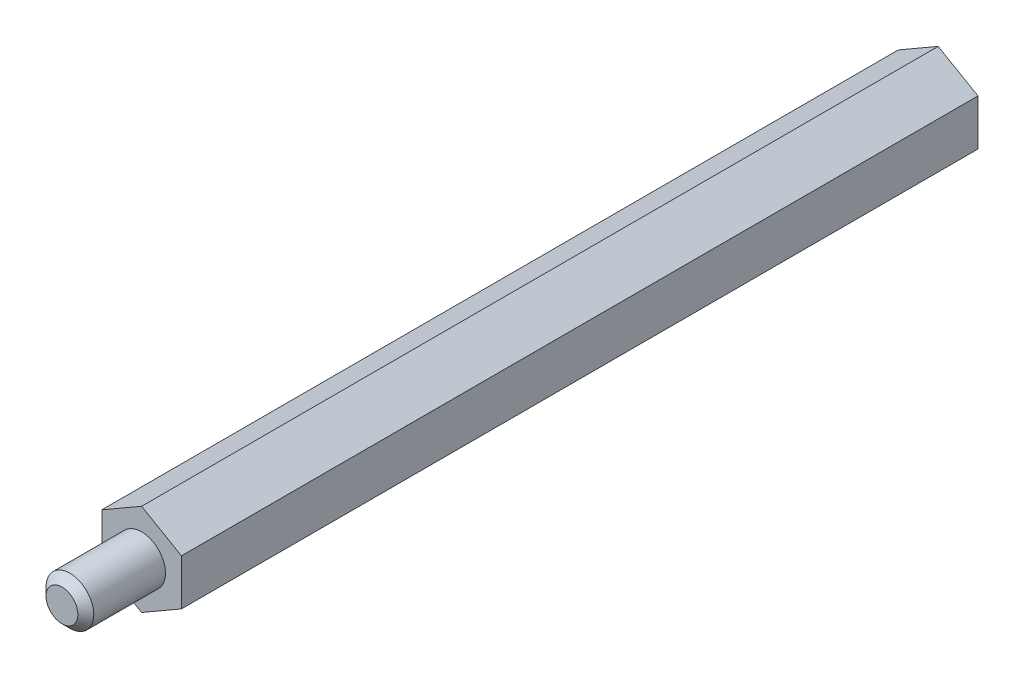
ISO-10303-21;
HEADER;
FILE_DESCRIPTION(('STEP AP214'),'2;1');
FILE_NAME('part.step','',(''),(''),'','','');
FILE_SCHEMA(('AUTOMOTIVE_DESIGN { 1 0 10303 214 1 1 1 1 }'));
ENDSEC;
DATA;
#1=APPLICATION_CONTEXT('core data for automotive mechanical design processes');
#2=APPLICATION_PROTOCOL_DEFINITION('international standard','automotive_design',2000,#1);
#3=PRODUCT_CONTEXT('',#1,'mechanical');
#4=PRODUCT('Part','Part','',(#3));
#5=PRODUCT_RELATED_PRODUCT_CATEGORY('part','',(#4));
#6=PRODUCT_DEFINITION_FORMATION('','',#4);
#7=PRODUCT_DEFINITION_CONTEXT('part definition',#1,'design');
#8=PRODUCT_DEFINITION('design','',#6,#7);
#9=PRODUCT_DEFINITION_SHAPE('','',#8);
#10=(LENGTH_UNIT() NAMED_UNIT(*) SI_UNIT(.MILLI.,.METRE.));
#11=(NAMED_UNIT(*) PLANE_ANGLE_UNIT() SI_UNIT($,.RADIAN.));
#12=(NAMED_UNIT(*) SI_UNIT($,.STERADIAN.) SOLID_ANGLE_UNIT());
#13=UNCERTAINTY_MEASURE_WITH_UNIT(LENGTH_MEASURE(1.E-05),#10,'distance_accuracy_value','');
#14=(GEOMETRIC_REPRESENTATION_CONTEXT(3) GLOBAL_UNCERTAINTY_ASSIGNED_CONTEXT((#13)) GLOBAL_UNIT_ASSIGNED_CONTEXT((#10,
#11,#12)) REPRESENTATION_CONTEXT('',''));
#15=CARTESIAN_POINT('',(0.,0.,0.));
#16=DIRECTION('',(0.,0.,1.));
#17=DIRECTION('',(1.,0.,0.));
#18=AXIS2_PLACEMENT_3D('',#15,#16,#17);
#19=CARTESIAN_POINT('',(0.,-2.88675134594813,50.));
#20=DIRECTION('',(-0.5,0.866025403784439,0.));
#21=DIRECTION('',(-0.866025403784439,-0.5,0.));
#22=AXIS2_PLACEMENT_3D('',#19,#20,#21);
#23=PLANE('',#22);
#24=DIRECTION('',(0.866025403784439,0.5,0.));
#25=VECTOR('',#24,1.);
#26=CARTESIAN_POINT('',(0.,-2.88675134594813,0.));
#27=LINE('',#26,#25);
#28=CARTESIAN_POINT('',(0.,-2.88675134594813,0.));
#29=VERTEX_POINT('',#28);
#30=CARTESIAN_POINT('',(2.5,-1.44337567297407,0.));
#31=VERTEX_POINT('',#30);
#32=EDGE_CURVE('E118',#29,#31,#27,.T.);
#33=ORIENTED_EDGE('',*,*,#32,.T.);
#34=DIRECTION('',(0.,0.,-1.));
#35=VECTOR('',#34,1.);
#36=CARTESIAN_POINT('',(2.5,-1.44337567297407,50.));
#37=LINE('',#36,#35);
#38=CARTESIAN_POINT('',(2.5,-1.44337567297407,50.));
#39=VERTEX_POINT('',#38);
#40=EDGE_CURVE('E136',#39,#31,#37,.T.);
#41=ORIENTED_EDGE('',*,*,#40,.F.);
#42=DIRECTION('',(0.866025403784439,0.5,0.));
#43=VECTOR('',#42,1.);
#44=CARTESIAN_POINT('',(0.,-2.88675134594813,50.));
#45=LINE('',#44,#43);
#46=CARTESIAN_POINT('',(0.,-2.88675134594813,50.));
#47=VERTEX_POINT('',#46);
#48=EDGE_CURVE('E129',#47,#39,#45,.T.);
#49=ORIENTED_EDGE('',*,*,#48,.F.);
#50=DIRECTION('',(0.,0.,-1.));
#51=VECTOR('',#50,1.);
#52=CARTESIAN_POINT('',(0.,-2.88675134594813,50.));
#53=LINE('',#52,#51);
#54=EDGE_CURVE('E114',#47,#29,#53,.T.);
#55=ORIENTED_EDGE('',*,*,#54,.T.);
#56=EDGE_LOOP('',(#33,#41,#49,#55));
#57=FACE_BOUND('',#56,.T.);
#58=ADVANCED_FACE('F32',(#57),#23,.F.);
#59=CARTESIAN_POINT('',(2.5,-1.44337567297407,50.));
#60=DIRECTION('',(-1.,0.,0.));
#61=DIRECTION('',(0.,0.,1.));
#62=AXIS2_PLACEMENT_3D('',#59,#60,#61);
#63=PLANE('',#62);
#64=DIRECTION('',(0.,1.,0.));
#65=VECTOR('',#64,1.);
#66=CARTESIAN_POINT('',(2.5,-1.44337567297407,0.));
#67=LINE('',#66,#65);
#68=CARTESIAN_POINT('',(2.5,1.44337567297407,0.));
#69=VERTEX_POINT('',#68);
#70=EDGE_CURVE('E121',#31,#69,#67,.T.);
#71=ORIENTED_EDGE('',*,*,#70,.T.);
#72=DIRECTION('',(0.,0.,-1.));
#73=VECTOR('',#72,1.);
#74=CARTESIAN_POINT('',(2.5,1.44337567297407,50.));
#75=LINE('',#74,#73);
#76=CARTESIAN_POINT('',(2.5,1.44337567297407,50.));
#77=VERTEX_POINT('',#76);
#78=EDGE_CURVE('E133',#77,#69,#75,.T.);
#79=ORIENTED_EDGE('',*,*,#78,.F.);
#80=DIRECTION('',(0.,1.,0.));
#81=VECTOR('',#80,1.);
#82=CARTESIAN_POINT('',(2.5,-1.44337567297407,50.));
#83=LINE('',#82,#81);
#84=EDGE_CURVE('E87',#39,#77,#83,.T.);
#85=ORIENTED_EDGE('',*,*,#84,.F.);
#86=ORIENTED_EDGE('',*,*,#40,.T.);
#87=EDGE_LOOP('',(#71,#79,#85,#86));
#88=FACE_BOUND('',#87,.T.);
#89=ADVANCED_FACE('F153',(#88),#63,.F.);
#90=CARTESIAN_POINT('',(2.5,1.44337567297407,50.));
#91=DIRECTION('',(-0.5,-0.866025403784439,0.));
#92=DIRECTION('',(0.866025403784439,-0.5,0.));
#93=AXIS2_PLACEMENT_3D('',#90,#91,#92);
#94=PLANE('',#93);
#95=DIRECTION('',(-0.866025403784439,0.5,0.));
#96=VECTOR('',#95,1.);
#97=CARTESIAN_POINT('',(2.5,1.44337567297407,0.));
#98=LINE('',#97,#96);
#99=CARTESIAN_POINT('',(0.,2.88675134594813,0.));
#100=VERTEX_POINT('',#99);
#101=EDGE_CURVE('E124',#69,#100,#98,.T.);
#102=ORIENTED_EDGE('',*,*,#101,.T.);
#103=DIRECTION('',(0.,0.,-1.));
#104=VECTOR('',#103,1.);
#105=CARTESIAN_POINT('',(0.,2.88675134594813,50.));
#106=LINE('',#105,#104);
#107=CARTESIAN_POINT('',(0.,2.88675134594813,50.));
#108=VERTEX_POINT('',#107);
#109=EDGE_CURVE('E109',#108,#100,#106,.T.);
#110=ORIENTED_EDGE('',*,*,#109,.F.);
#111=DIRECTION('',(-0.866025403784439,0.5,0.));
#112=VECTOR('',#111,1.);
#113=CARTESIAN_POINT('',(2.5,1.44337567297407,50.));
#114=LINE('',#113,#112);
#115=EDGE_CURVE('E100',#77,#108,#114,.T.);
#116=ORIENTED_EDGE('',*,*,#115,.F.);
#117=ORIENTED_EDGE('',*,*,#78,.T.);
#118=EDGE_LOOP('',(#102,#110,#116,#117));
#119=FACE_BOUND('',#118,.T.);
#120=ADVANCED_FACE('F158',(#119),#94,.F.);
#121=CARTESIAN_POINT('',(0.,2.88675134594813,50.));
#122=DIRECTION('',(0.5,-0.866025403784439,0.));
#123=DIRECTION('',(0.866025403784439,0.5,0.));
#124=AXIS2_PLACEMENT_3D('',#121,#122,#123);
#125=PLANE('',#124);
#126=DIRECTION('',(-0.866025403784439,-0.5,0.));
#127=VECTOR('',#126,1.);
#128=CARTESIAN_POINT('',(0.,2.88675134594813,0.));
#129=LINE('',#128,#127);
#130=CARTESIAN_POINT('',(-2.5,1.44337567297407,0.));
#131=VERTEX_POINT('',#130);
#132=EDGE_CURVE('E108',#100,#131,#129,.T.);
#133=ORIENTED_EDGE('',*,*,#132,.T.);
#134=DIRECTION('',(0.,0.,-1.));
#135=VECTOR('',#134,1.);
#136=CARTESIAN_POINT('',(-2.5,1.44337567297407,50.));
#137=LINE('',#136,#135);
#138=CARTESIAN_POINT('',(-2.5,1.44337567297407,50.));
#139=VERTEX_POINT('',#138);
#140=EDGE_CURVE('E105',#139,#131,#137,.T.);
#141=ORIENTED_EDGE('',*,*,#140,.F.);
#142=DIRECTION('',(-0.866025403784439,-0.5,0.));
#143=VECTOR('',#142,1.);
#144=CARTESIAN_POINT('',(0.,2.88675134594813,50.));
#145=LINE('',#144,#143);
#146=EDGE_CURVE('E94',#108,#139,#145,.T.);
#147=ORIENTED_EDGE('',*,*,#146,.F.);
#148=ORIENTED_EDGE('',*,*,#109,.T.);
#149=EDGE_LOOP('',(#133,#141,#147,#148));
#150=FACE_BOUND('',#149,.T.);
#151=ADVANCED_FACE('F106',(#150),#125,.F.);
#152=CARTESIAN_POINT('',(-2.5,1.44337567297407,50.));
#153=DIRECTION('',(1.,0.,0.));
#154=DIRECTION('',(0.,1.,0.));
#155=AXIS2_PLACEMENT_3D('',#152,#153,#154);
#156=PLANE('',#155);
#157=DIRECTION('',(0.,-1.,0.));
#158=VECTOR('',#157,1.);
#159=CARTESIAN_POINT('',(-2.5,1.44337567297407,0.));
#160=LINE('',#159,#158);
#161=CARTESIAN_POINT('',(-2.5,-1.44337567297406,0.));
#162=VERTEX_POINT('',#161);
#163=EDGE_CURVE('E72',#131,#162,#160,.T.);
#164=ORIENTED_EDGE('',*,*,#163,.T.);
#165=DIRECTION('',(0.,0.,-1.));
#166=VECTOR('',#165,1.);
#167=CARTESIAN_POINT('',(-2.5,-1.44337567297406,50.));
#168=LINE('',#167,#166);
#169=CARTESIAN_POINT('',(-2.5,-1.44337567297406,50.));
#170=VERTEX_POINT('',#169);
#171=EDGE_CURVE('E110',#170,#162,#168,.T.);
#172=ORIENTED_EDGE('',*,*,#171,.F.);
#173=DIRECTION('',(0.,-1.,0.));
#174=VECTOR('',#173,1.);
#175=CARTESIAN_POINT('',(-2.5,1.44337567297407,50.));
#176=LINE('',#175,#174);
#177=EDGE_CURVE('E98',#139,#170,#176,.T.);
#178=ORIENTED_EDGE('',*,*,#177,.F.);
#179=ORIENTED_EDGE('',*,*,#140,.T.);
#180=EDGE_LOOP('',(#164,#172,#178,#179));
#181=FACE_BOUND('',#180,.T.);
#182=ADVANCED_FACE('F112',(#181),#156,.F.);
#183=CARTESIAN_POINT('',(-2.5,-1.44337567297406,50.));
#184=DIRECTION('',(0.5,0.866025403784439,0.));
#185=DIRECTION('',(-0.866025403784439,0.5,0.));
#186=AXIS2_PLACEMENT_3D('',#183,#184,#185);
#187=PLANE('',#186);
#188=DIRECTION('',(0.866025403784439,-0.5,0.));
#189=VECTOR('',#188,1.);
#190=CARTESIAN_POINT('',(-2.5,-1.44337567297406,0.));
#191=LINE('',#190,#189);
#192=EDGE_CURVE('E78',#162,#29,#191,.T.);
#193=ORIENTED_EDGE('',*,*,#192,.T.);
#194=ORIENTED_EDGE('',*,*,#54,.F.);
#195=DIRECTION('',(0.866025403784439,-0.5,0.));
#196=VECTOR('',#195,1.);
#197=CARTESIAN_POINT('',(-2.5,-1.44337567297406,50.));
#198=LINE('',#197,#196);
#199=EDGE_CURVE('E49',#170,#47,#198,.T.);
#200=ORIENTED_EDGE('',*,*,#199,.F.);
#201=ORIENTED_EDGE('',*,*,#171,.T.);
#202=EDGE_LOOP('',(#193,#194,#200,#201));
#203=FACE_BOUND('',#202,.T.);
#204=ADVANCED_FACE('F168',(#203),#187,.F.);
#205=CARTESIAN_POINT('',(0.,0.,50.));
#206=DIRECTION('',(0.,0.,1.));
#207=DIRECTION('',(1.,0.,0.));
#208=AXIS2_PLACEMENT_3D('',#205,#206,#207);
#209=PLANE('',#208);
#210=CARTESIAN_POINT('',(0.,0.,50.));
#211=DIRECTION('',(0.,0.,1.));
#212=DIRECTION('',(1.,0.,0.));
#213=AXIS2_PLACEMENT_3D('',#210,#211,#212);
#214=CIRCLE('',#213,1.5);
#215=CARTESIAN_POINT('',(1.5,0.,50.));
#216=VERTEX_POINT('',#215);
#217=EDGE_CURVE('E122',#216,#216,#214,.T.);
#218=ORIENTED_EDGE('',*,*,#217,.F.);
#219=EDGE_LOOP('',(#218));
#220=FACE_BOUND('',#219,.T.);
#221=ORIENTED_EDGE('',*,*,#48,.T.);
#222=ORIENTED_EDGE('',*,*,#84,.T.);
#223=ORIENTED_EDGE('',*,*,#115,.T.);
#224=ORIENTED_EDGE('',*,*,#146,.T.);
#225=ORIENTED_EDGE('',*,*,#177,.T.);
#226=ORIENTED_EDGE('',*,*,#199,.T.);
#227=EDGE_LOOP('',(#221,#222,#223,#224,#225,#226));
#228=FACE_BOUND('',#227,.T.);
#229=ADVANCED_FACE('F96',(#220,#228),#209,.T.);
#230=CARTESIAN_POINT('',(0.,0.,0.));
#231=DIRECTION('',(0.,0.,1.));
#232=DIRECTION('',(1.,0.,0.));
#233=AXIS2_PLACEMENT_3D('',#230,#231,#232);
#234=PLANE('',#233);
#235=CARTESIAN_POINT('',(0.,0.,0.));
#236=DIRECTION('',(0.,0.,-1.));
#237=DIRECTION('',(-1.,0.,0.));
#238=AXIS2_PLACEMENT_3D('',#235,#236,#237);
#239=CIRCLE('',#238,1.25);
#240=CARTESIAN_POINT('',(-1.25,0.,0.));
#241=VERTEX_POINT('',#240);
#242=EDGE_CURVE('E194',#241,#241,#239,.T.);
#243=ORIENTED_EDGE('',*,*,#242,.F.);
#244=EDGE_LOOP('',(#243));
#245=FACE_BOUND('',#244,.T.);
#246=ORIENTED_EDGE('',*,*,#32,.F.);
#247=ORIENTED_EDGE('',*,*,#192,.F.);
#248=ORIENTED_EDGE('',*,*,#163,.F.);
#249=ORIENTED_EDGE('',*,*,#132,.F.);
#250=ORIENTED_EDGE('',*,*,#101,.F.);
#251=ORIENTED_EDGE('',*,*,#70,.F.);
#252=EDGE_LOOP('',(#246,#247,#248,#249,#250,#251));
#253=FACE_BOUND('',#252,.T.);
#254=ADVANCED_FACE('F171',(#245,#253),#234,.F.);
#255=CARTESIAN_POINT('',(0.,0.,55.));
#256=DIRECTION('',(0.,0.,-1.));
#257=DIRECTION('',(-1.,0.,0.));
#258=AXIS2_PLACEMENT_3D('',#255,#256,#257);
#259=CYLINDRICAL_SURFACE('',#258,1.5);
#260=CARTESIAN_POINT('',(0.,0.,54.5));
#261=DIRECTION('',(0.,0.,1.));
#262=DIRECTION('',(1.,0.,0.));
#263=AXIS2_PLACEMENT_3D('',#260,#261,#262);
#264=CIRCLE('',#263,1.5);
#265=CARTESIAN_POINT('',(1.5,0.,54.5));
#266=VERTEX_POINT('',#265);
#267=EDGE_CURVE('E11',#266,#266,#264,.F.);
#268=ORIENTED_EDGE('',*,*,#267,.T.);
#269=EDGE_LOOP('',(#268));
#270=FACE_BOUND('',#269,.T.);
#271=ORIENTED_EDGE('',*,*,#217,.T.);
#272=EDGE_LOOP('',(#271));
#273=FACE_BOUND('',#272,.T.);
#274=ADVANCED_FACE('F174',(#270,#273),#259,.T.);
#275=CARTESIAN_POINT('',(0.,0.,55.));
#276=DIRECTION('',(0.,0.,1.));
#277=DIRECTION('',(1.,0.,0.));
#278=AXIS2_PLACEMENT_3D('',#275,#276,#277);
#279=PLANE('',#278);
#280=CARTESIAN_POINT('',(0.,0.,55.));
#281=DIRECTION('',(0.,0.,1.));
#282=DIRECTION('',(1.,0.,0.));
#283=AXIS2_PLACEMENT_3D('',#280,#281,#282);
#284=CIRCLE('',#283,1.);
#285=CARTESIAN_POINT('',(1.,0.,55.));
#286=VERTEX_POINT('',#285);
#287=EDGE_CURVE('E41',#286,#286,#284,.T.);
#288=ORIENTED_EDGE('',*,*,#287,.T.);
#289=EDGE_LOOP('',(#288));
#290=FACE_BOUND('',#289,.T.);
#291=ADVANCED_FACE('F140',(#290),#279,.T.);
#292=CARTESIAN_POINT('',(0.,0.,10.));
#293=DIRECTION('',(0.,0.,-1.));
#294=DIRECTION('',(-1.,0.,0.));
#295=AXIS2_PLACEMENT_3D('',#292,#293,#294);
#296=CYLINDRICAL_SURFACE('',#295,1.25);
#297=CARTESIAN_POINT('',(0.,0.,10.));
#298=DIRECTION('',(0.,0.,-1.));
#299=DIRECTION('',(-1.,0.,0.));
#300=AXIS2_PLACEMENT_3D('',#297,#298,#299);
#301=CIRCLE('',#300,1.25);
#302=CARTESIAN_POINT('',(-1.25,0.,10.));
#303=VERTEX_POINT('',#302);
#304=EDGE_CURVE('E191',#303,#303,#301,.T.);
#305=ORIENTED_EDGE('',*,*,#304,.F.);
#306=EDGE_LOOP('',(#305));
#307=FACE_BOUND('',#306,.T.);
#308=ORIENTED_EDGE('',*,*,#242,.T.);
#309=EDGE_LOOP('',(#308));
#310=FACE_BOUND('',#309,.T.);
#311=ADVANCED_FACE('F148',(#307,#310),#296,.F.);
#312=CARTESIAN_POINT('',(0.,0.,10.));
#313=DIRECTION('',(0.,0.,-1.));
#314=DIRECTION('',(-1.,0.,0.));
#315=AXIS2_PLACEMENT_3D('',#312,#313,#314);
#316=PLANE('',#315);
#317=ORIENTED_EDGE('',*,*,#304,.T.);
#318=EDGE_LOOP('',(#317));
#319=FACE_BOUND('',#318,.T.);
#320=ADVANCED_FACE('F143',(#319),#316,.T.);
#321=CARTESIAN_POINT('',(0.,0.,55.));
#322=DIRECTION('',(0.,0.,-1.));
#323=DIRECTION('',(-1.,0.,0.));
#324=AXIS2_PLACEMENT_3D('',#321,#322,#323);
#325=CONICAL_SURFACE('',#324,1.,0.78539816339744);
#326=ORIENTED_EDGE('',*,*,#267,.F.);
#327=EDGE_LOOP('',(#326));
#328=FACE_BOUND('',#327,.T.);
#329=ORIENTED_EDGE('',*,*,#287,.F.);
#330=EDGE_LOOP('',(#329));
#331=FACE_BOUND('',#330,.T.);
#332=ADVANCED_FACE('F34',(#328,#331),#325,.T.);
#333=CLOSED_SHELL('',(#58,#89,#120,#151,#182,#204,#229,#254,#274,#291,#311,#320,#332));
#334=MANIFOLD_SOLID_BREP('B2',#333);
#335=ADVANCED_BREP_SHAPE_REPRESENTATION('',(#18,#334),#14);
#336=SHAPE_DEFINITION_REPRESENTATION(#9,#335);
ENDSEC;
END-ISO-10303-21;
